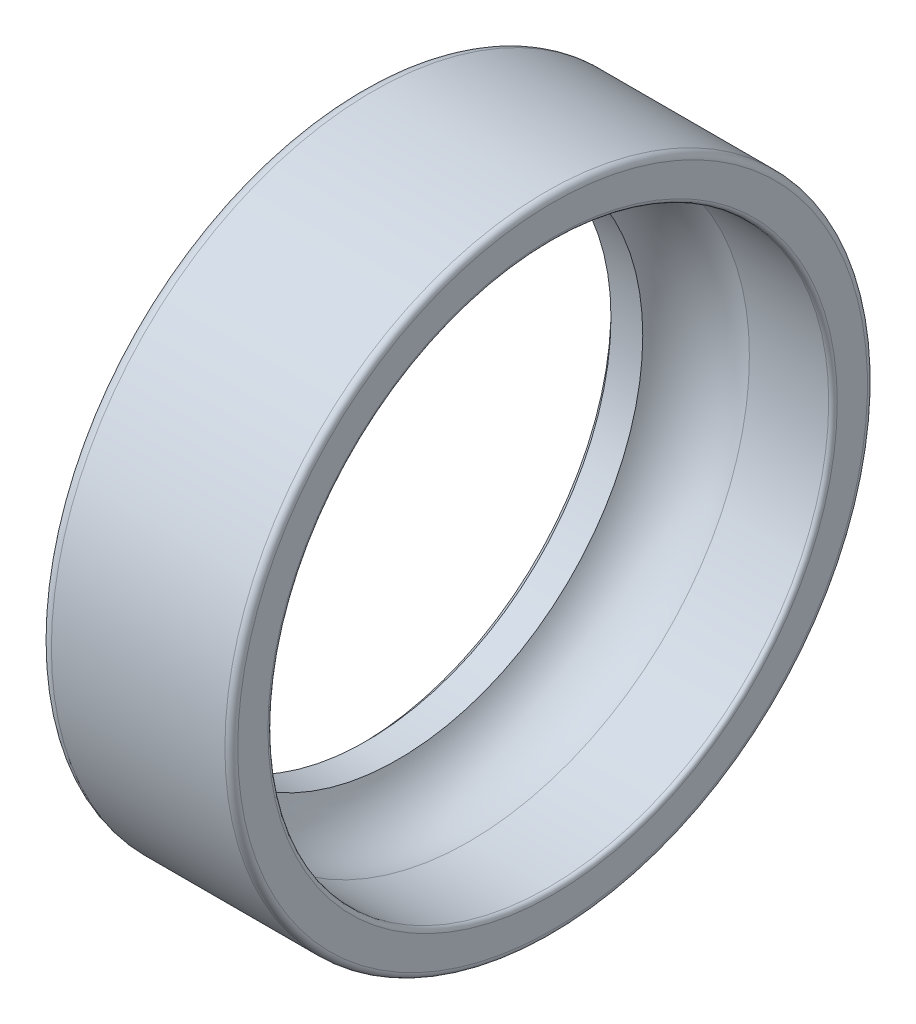
ISO-10303-21;
HEADER;
FILE_DESCRIPTION(('STEP AP214'),'2;1');
FILE_NAME('part.step','',(''),(''),'','','');
FILE_SCHEMA(('AUTOMOTIVE_DESIGN { 1 0 10303 214 1 1 1 1 }'));
ENDSEC;
DATA;
#1=APPLICATION_CONTEXT('core data for automotive mechanical design processes');
#2=APPLICATION_PROTOCOL_DEFINITION('international standard','automotive_design',2000,#1);
#3=PRODUCT_CONTEXT('',#1,'mechanical');
#4=PRODUCT('Part','Part','',(#3));
#5=PRODUCT_RELATED_PRODUCT_CATEGORY('part','',(#4));
#6=PRODUCT_DEFINITION_FORMATION('','',#4);
#7=PRODUCT_DEFINITION_CONTEXT('part definition',#1,'design');
#8=PRODUCT_DEFINITION('design','',#6,#7);
#9=PRODUCT_DEFINITION_SHAPE('','',#8);
#10=(LENGTH_UNIT() NAMED_UNIT(*) SI_UNIT(.MILLI.,.METRE.));
#11=(NAMED_UNIT(*) PLANE_ANGLE_UNIT() SI_UNIT($,.RADIAN.));
#12=(NAMED_UNIT(*) SI_UNIT($,.STERADIAN.) SOLID_ANGLE_UNIT());
#13=UNCERTAINTY_MEASURE_WITH_UNIT(LENGTH_MEASURE(1.E-05),#10,'distance_accuracy_value','');
#14=(GEOMETRIC_REPRESENTATION_CONTEXT(3) GLOBAL_UNCERTAINTY_ASSIGNED_CONTEXT((#13)) GLOBAL_UNIT_ASSIGNED_CONTEXT((#10,
#11,#12)) REPRESENTATION_CONTEXT('',''));
#15=CARTESIAN_POINT('',(0.,0.,0.));
#16=DIRECTION('',(0.,0.,1.));
#17=DIRECTION('',(1.,0.,0.));
#18=AXIS2_PLACEMENT_3D('',#15,#16,#17);
#19=CARTESIAN_POINT('',(0.,14.4,0.));
#20=DIRECTION('',(1.,0.,0.));
#21=DIRECTION('',(0.,0.,-1.));
#22=AXIS2_PLACEMENT_3D('',#19,#20,#21);
#23=PLANE('',#22);
#24=CARTESIAN_POINT('',(0.,0.,0.));
#25=DIRECTION('',(-1.,0.,0.));
#26=DIRECTION('',(0.,0.,1.));
#27=AXIS2_PLACEMENT_3D('',#24,#25,#26);
#28=CIRCLE('',#27,11.725);
#29=CARTESIAN_POINT('',(0.,0.,11.725));
#30=VERTEX_POINT('',#29);
#31=EDGE_CURVE('E65',#30,#30,#28,.T.);
#32=ORIENTED_EDGE('',*,*,#31,.F.);
#33=EDGE_LOOP('',(#32));
#34=FACE_BOUND('',#33,.T.);
#35=CARTESIAN_POINT('',(0.,0.,0.));
#36=DIRECTION('',(-1.,0.,0.));
#37=DIRECTION('',(0.,0.,1.));
#38=AXIS2_PLACEMENT_3D('',#35,#36,#37);
#39=CIRCLE('',#38,14.4);
#40=CARTESIAN_POINT('',(0.,0.,14.4));
#41=VERTEX_POINT('',#40);
#42=EDGE_CURVE('E10',#41,#41,#39,.T.);
#43=ORIENTED_EDGE('',*,*,#42,.T.);
#44=EDGE_LOOP('',(#43));
#45=FACE_BOUND('',#44,.T.);
#46=ADVANCED_FACE('F31',(#34,#45),#23,.F.);
#47=CARTESIAN_POINT('',(0.599999999999874,0.,0.));
#48=DIRECTION('',(-1.,0.,0.));
#49=DIRECTION('',(0.,0.,1.));
#50=AXIS2_PLACEMENT_3D('',#47,#48,#49);
#51=TOROIDAL_SURFACE('',#50,14.4000000000001,0.599999999999875);
#52=ORIENTED_EDGE('',*,*,#42,.F.);
#53=EDGE_LOOP('',(#52));
#54=FACE_BOUND('',#53,.T.);
#55=CARTESIAN_POINT('',(0.6,0.,0.));
#56=DIRECTION('',(-1.,0.,0.));
#57=DIRECTION('',(0.,0.,1.));
#58=AXIS2_PLACEMENT_3D('',#55,#56,#57);
#59=CIRCLE('',#58,15.);
#60=CARTESIAN_POINT('',(0.6,0.,15.));
#61=VERTEX_POINT('',#60);
#62=EDGE_CURVE('E37',#61,#61,#59,.T.);
#63=ORIENTED_EDGE('',*,*,#62,.T.);
#64=EDGE_LOOP('',(#63));
#65=FACE_BOUND('',#64,.T.);
#66=ADVANCED_FACE('F72',(#54,#65),#51,.T.);
#67=CARTESIAN_POINT('',(9.,0.,0.));
#68=DIRECTION('',(-1.,0.,0.));
#69=DIRECTION('',(0.,0.,1.));
#70=AXIS2_PLACEMENT_3D('',#67,#68,#69);
#71=CYLINDRICAL_SURFACE('',#70,15.);
#72=ORIENTED_EDGE('',*,*,#62,.F.);
#73=EDGE_LOOP('',(#72));
#74=FACE_BOUND('',#73,.T.);
#75=CARTESIAN_POINT('',(8.7,0.,0.));
#76=DIRECTION('',(-1.,0.,0.));
#77=DIRECTION('',(0.,0.,1.));
#78=AXIS2_PLACEMENT_3D('',#75,#76,#77);
#79=CIRCLE('',#78,15.);
#80=CARTESIAN_POINT('',(8.7,0.,15.));
#81=VERTEX_POINT('',#80);
#82=EDGE_CURVE('E41',#81,#81,#79,.T.);
#83=ORIENTED_EDGE('',*,*,#82,.T.);
#84=EDGE_LOOP('',(#83));
#85=FACE_BOUND('',#84,.T.);
#86=ADVANCED_FACE('F76',(#74,#85),#71,.T.);
#87=CARTESIAN_POINT('',(8.70000000000012,0.,0.));
#88=DIRECTION('',(-1.,0.,0.));
#89=DIRECTION('',(0.,0.,1.));
#90=AXIS2_PLACEMENT_3D('',#87,#88,#89);
#91=TOROIDAL_SURFACE('',#90,14.7000000000001,0.299999999999875);
#92=ORIENTED_EDGE('',*,*,#82,.F.);
#93=EDGE_LOOP('',(#92));
#94=FACE_BOUND('',#93,.T.);
#95=CARTESIAN_POINT('',(9.,0.,0.));
#96=DIRECTION('',(-1.,0.,0.));
#97=DIRECTION('',(0.,0.,1.));
#98=AXIS2_PLACEMENT_3D('',#95,#96,#97);
#99=CIRCLE('',#98,14.7);
#100=CARTESIAN_POINT('',(9.,0.,14.7));
#101=VERTEX_POINT('',#100);
#102=EDGE_CURVE('E45',#101,#101,#99,.T.);
#103=ORIENTED_EDGE('',*,*,#102,.T.);
#104=EDGE_LOOP('',(#103));
#105=FACE_BOUND('',#104,.T.);
#106=ADVANCED_FACE('F81',(#94,#105),#91,.T.);
#107=CARTESIAN_POINT('',(9.,13.29,0.));
#108=DIRECTION('',(-1.,0.,0.));
#109=DIRECTION('',(0.,0.,1.));
#110=AXIS2_PLACEMENT_3D('',#107,#108,#109);
#111=PLANE('',#110);
#112=ORIENTED_EDGE('',*,*,#102,.F.);
#113=EDGE_LOOP('',(#112));
#114=FACE_BOUND('',#113,.T.);
#115=CARTESIAN_POINT('',(9.,0.,0.));
#116=DIRECTION('',(-1.,0.,0.));
#117=DIRECTION('',(0.,0.,1.));
#118=AXIS2_PLACEMENT_3D('',#115,#116,#117);
#119=CIRCLE('',#118,13.2900000000005);
#120=CARTESIAN_POINT('',(9.,0.,13.2900000000005));
#121=VERTEX_POINT('',#120);
#122=EDGE_CURVE('E50',#121,#121,#119,.T.);
#123=ORIENTED_EDGE('',*,*,#122,.T.);
#124=EDGE_LOOP('',(#123));
#125=FACE_BOUND('',#124,.T.);
#126=ADVANCED_FACE('F87',(#114,#125),#111,.F.);
#127=CARTESIAN_POINT('',(8.79999999999945,0.,0.));
#128=DIRECTION('',(-1.,0.,0.));
#129=DIRECTION('',(0.,0.,1.));
#130=AXIS2_PLACEMENT_3D('',#127,#128,#129);
#131=TOROIDAL_SURFACE('',#130,13.2900000000005,0.200000000000545);
#132=ORIENTED_EDGE('',*,*,#122,.F.);
#133=EDGE_LOOP('',(#132));
#134=FACE_BOUND('',#133,.T.);
#135=CARTESIAN_POINT('',(8.8,0.,0.));
#136=DIRECTION('',(-1.,0.,0.));
#137=DIRECTION('',(0.,0.,1.));
#138=AXIS2_PLACEMENT_3D('',#135,#136,#137);
#139=CIRCLE('',#138,13.09);
#140=CARTESIAN_POINT('',(8.8,0.,13.09));
#141=VERTEX_POINT('',#140);
#142=EDGE_CURVE('E53',#141,#141,#139,.T.);
#143=ORIENTED_EDGE('',*,*,#142,.T.);
#144=EDGE_LOOP('',(#143));
#145=FACE_BOUND('',#144,.T.);
#146=ADVANCED_FACE('F91',(#134,#145),#131,.T.);
#147=CARTESIAN_POINT('',(9.,0.,0.));
#148=DIRECTION('',(-1.,0.,0.));
#149=DIRECTION('',(0.,0.,1.));
#150=AXIS2_PLACEMENT_3D('',#147,#148,#149);
#151=CYLINDRICAL_SURFACE('',#150,13.09);
#152=ORIENTED_EDGE('',*,*,#142,.F.);
#153=EDGE_LOOP('',(#152));
#154=FACE_BOUND('',#153,.T.);
#155=CARTESIAN_POINT('',(5.096992462264,0.,0.));
#156=DIRECTION('',(-1.,0.,0.));
#157=DIRECTION('',(0.,0.,1.));
#158=AXIS2_PLACEMENT_3D('',#155,#156,#157);
#159=CIRCLE('',#158,13.09);
#160=CARTESIAN_POINT('',(5.096992462264,0.,13.09));
#161=VERTEX_POINT('',#160);
#162=EDGE_CURVE('E56',#161,#161,#159,.T.);
#163=ORIENTED_EDGE('',*,*,#162,.T.);
#164=EDGE_LOOP('',(#163));
#165=FACE_BOUND('',#164,.T.);
#166=ADVANCED_FACE('F95',(#154,#165),#151,.F.);
#167=CARTESIAN_POINT('',(4.4999999999999,0.,0.));
#168=DIRECTION('',(-1.,0.,0.));
#169=DIRECTION('',(0.,0.,1.));
#170=AXIS2_PLACEMENT_3D('',#167,#168,#169);
#171=TOROIDAL_SURFACE('',#170,10.1500000000001,2.99999999999991);
#172=ORIENTED_EDGE('',*,*,#162,.F.);
#173=EDGE_LOOP('',(#172));
#174=FACE_BOUND('',#173,.T.);
#175=CARTESIAN_POINT('',(1.7844199514652,0.,0.));
#176=DIRECTION('',(-1.,0.,0.));
#177=DIRECTION('',(0.,0.,1.));
#178=AXIS2_PLACEMENT_3D('',#175,#176,#177);
#179=CIRCLE('',#178,11.425);
#180=CARTESIAN_POINT('',(1.7844199514652,0.,11.425));
#181=VERTEX_POINT('',#180);
#182=EDGE_CURVE('E59',#181,#181,#179,.T.);
#183=ORIENTED_EDGE('',*,*,#182,.T.);
#184=EDGE_LOOP('',(#183));
#185=FACE_BOUND('',#184,.T.);
#186=ADVANCED_FACE('F99',(#174,#185),#171,.F.);
#187=CARTESIAN_POINT('',(9.,0.,0.));
#188=DIRECTION('',(-1.,0.,0.));
#189=DIRECTION('',(0.,0.,1.));
#190=AXIS2_PLACEMENT_3D('',#187,#188,#189);
#191=CYLINDRICAL_SURFACE('',#190,11.425);
#192=ORIENTED_EDGE('',*,*,#182,.F.);
#193=EDGE_LOOP('',(#192));
#194=FACE_BOUND('',#193,.T.);
#195=CARTESIAN_POINT('',(0.3,0.,0.));
#196=DIRECTION('',(-1.,0.,0.));
#197=DIRECTION('',(0.,0.,1.));
#198=AXIS2_PLACEMENT_3D('',#195,#196,#197);
#199=CIRCLE('',#198,11.425);
#200=CARTESIAN_POINT('',(0.3,0.,11.425));
#201=VERTEX_POINT('',#200);
#202=EDGE_CURVE('E62',#201,#201,#199,.T.);
#203=ORIENTED_EDGE('',*,*,#202,.T.);
#204=EDGE_LOOP('',(#203));
#205=FACE_BOUND('',#204,.T.);
#206=ADVANCED_FACE('F103',(#194,#205),#191,.F.);
#207=CARTESIAN_POINT('',(0.,0.,0.));
#208=DIRECTION('',(-1.,0.,0.));
#209=DIRECTION('',(0.,0.,1.));
#210=AXIS2_PLACEMENT_3D('',#207,#208,#209);
#211=CONICAL_SURFACE('',#210,11.725,0.785398163397448);
#212=ORIENTED_EDGE('',*,*,#202,.F.);
#213=EDGE_LOOP('',(#212));
#214=FACE_BOUND('',#213,.T.);
#215=ORIENTED_EDGE('',*,*,#31,.T.);
#216=EDGE_LOOP('',(#215));
#217=FACE_BOUND('',#216,.T.);
#218=ADVANCED_FACE('F69',(#214,#217),#211,.F.);
#219=CLOSED_SHELL('',(#46,#66,#86,#106,#126,#146,#166,#186,#206,#218));
#220=MANIFOLD_SOLID_BREP('B2',#219);
#221=ADVANCED_BREP_SHAPE_REPRESENTATION('',(#18,#220),#14);
#222=SHAPE_DEFINITION_REPRESENTATION(#9,#221);
ENDSEC;
END-ISO-10303-21;
